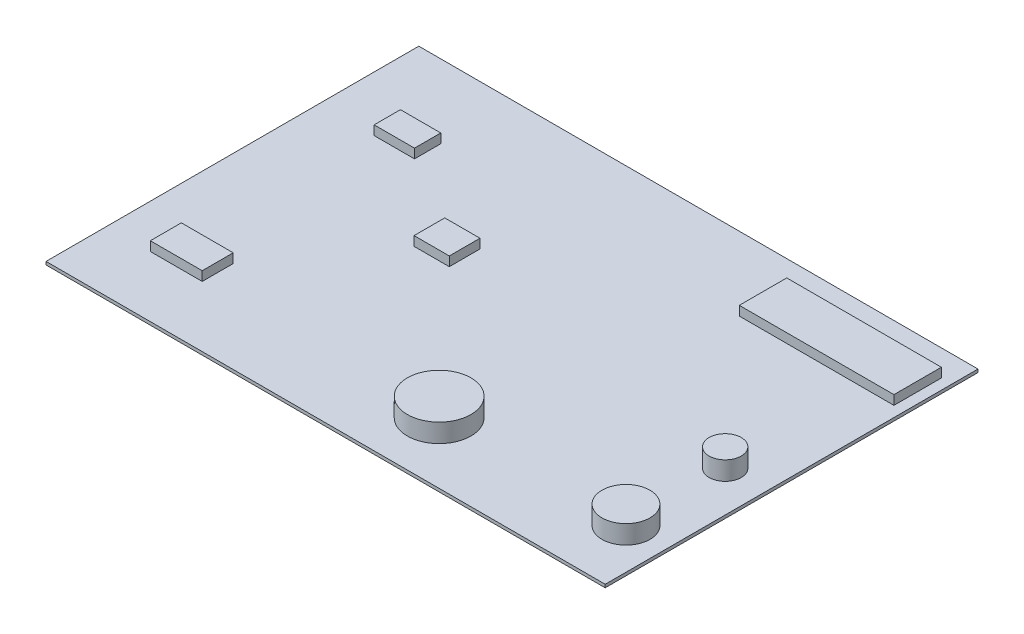
ISO-10303-21;
HEADER;
FILE_DESCRIPTION(('STEP AP214'),'2;1');
FILE_NAME('part.step','',(''),(''),'','','');
FILE_SCHEMA(('AUTOMOTIVE_DESIGN { 1 0 10303 214 1 1 1 1 }'));
ENDSEC;
DATA;
#1=APPLICATION_CONTEXT('core data for automotive mechanical design processes');
#2=APPLICATION_PROTOCOL_DEFINITION('international standard','automotive_design',2000,#1);
#3=PRODUCT_CONTEXT('',#1,'mechanical');
#4=PRODUCT('Part','Part','',(#3));
#5=PRODUCT_RELATED_PRODUCT_CATEGORY('part','',(#4));
#6=PRODUCT_DEFINITION_FORMATION('','',#4);
#7=PRODUCT_DEFINITION_CONTEXT('part definition',#1,'design');
#8=PRODUCT_DEFINITION('design','',#6,#7);
#9=PRODUCT_DEFINITION_SHAPE('','',#8);
#10=(LENGTH_UNIT() NAMED_UNIT(*) SI_UNIT(.MILLI.,.METRE.));
#11=(NAMED_UNIT(*) PLANE_ANGLE_UNIT() SI_UNIT($,.RADIAN.));
#12=(NAMED_UNIT(*) SI_UNIT($,.STERADIAN.) SOLID_ANGLE_UNIT());
#13=UNCERTAINTY_MEASURE_WITH_UNIT(LENGTH_MEASURE(1.E-05),#10,'distance_accuracy_value','');
#14=(GEOMETRIC_REPRESENTATION_CONTEXT(3) GLOBAL_UNCERTAINTY_ASSIGNED_CONTEXT((#13)) GLOBAL_UNIT_ASSIGNED_CONTEXT((#10,
#11,#12)) REPRESENTATION_CONTEXT('',''));
#15=CARTESIAN_POINT('',(0.,0.,0.));
#16=DIRECTION('',(0.,0.,1.));
#17=DIRECTION('',(1.,0.,0.));
#18=AXIS2_PLACEMENT_3D('',#15,#16,#17);
#19=CARTESIAN_POINT('',(0.,1.,0.));
#20=DIRECTION('',(0.,-1.,0.));
#21=DIRECTION('',(0.,0.,-1.));
#22=AXIS2_PLACEMENT_3D('',#19,#20,#21);
#23=PLANE('',#22);
#24=CARTESIAN_POINT('',(16.8474862712031,1.,40.2956843652191));
#25=DIRECTION('',(0.,-1.,0.));
#26=DIRECTION('',(0.,0.,-1.));
#27=AXIS2_PLACEMENT_3D('',#24,#25,#26);
#28=CIRCLE('',#27,10.2338599850955);
#29=CARTESIAN_POINT('',(16.8474862712031,1.,30.0618243801237));
#30=VERTEX_POINT('',#29);
#31=EDGE_CURVE('E11',#30,#30,#28,.F.);
#32=ORIENTED_EDGE('',*,*,#31,.F.);
#33=EDGE_LOOP('',(#32));
#34=FACE_BOUND('',#33,.T.);
#35=CARTESIAN_POINT('',(76.9816351317871,1.,40.2956843652191));
#36=DIRECTION('',(0.,-1.,0.));
#37=DIRECTION('',(0.,0.,-1.));
#38=AXIS2_PLACEMENT_3D('',#35,#36,#37);
#39=CIRCLE('',#38,7.72493284853617);
#40=CARTESIAN_POINT('',(76.9816351317871,1.,32.570751516683));
#41=VERTEX_POINT('',#40);
#42=EDGE_CURVE('E48',#41,#41,#39,.F.);
#43=ORIENTED_EDGE('',*,*,#42,.F.);
#44=EDGE_LOOP('',(#43));
#45=FACE_BOUND('',#44,.T.);
#46=CARTESIAN_POINT('',(76.9816351317871,1.,8.35863831628103));
#47=DIRECTION('',(0.,-1.,0.));
#48=DIRECTION('',(0.,0.,-1.));
#49=AXIS2_PLACEMENT_3D('',#46,#47,#48);
#50=CIRCLE('',#49,5.16431418154601);
#51=CARTESIAN_POINT('',(76.9816351317871,1.,3.19432413473502));
#52=VERTEX_POINT('',#51);
#53=EDGE_CURVE('E384',#52,#52,#50,.F.);
#54=ORIENTED_EDGE('',*,*,#53,.F.);
#55=EDGE_LOOP('',(#54));
#56=FACE_BOUND('',#55,.T.);
#57=DIRECTION('',(0.,0.,1.));
#58=VECTOR('',#57,1.);
#59=CARTESIAN_POINT('',(-34.9516533845815,1.,-13.3040241738058));
#60=LINE('',#59,#58);
#61=CARTESIAN_POINT('',(-34.9516533845815,1.,-13.3040241738058));
#62=VERTEX_POINT('',#61);
#63=CARTESIAN_POINT('',(-34.9516533845815,1.,-3.43040683304707));
#64=VERTEX_POINT('',#63);
#65=EDGE_CURVE('E201',#62,#64,#60,.T.);
#66=ORIENTED_EDGE('',*,*,#65,.F.);
#67=DIRECTION('',(-1.,0.,0.));
#68=VECTOR('',#67,1.);
#69=CARTESIAN_POINT('',(-34.9516533845815,1.,-13.3040241738058));
#70=LINE('',#69,#68);
#71=CARTESIAN_POINT('',(-23.6168154125664,1.,-13.3040241738058));
#72=VERTEX_POINT('',#71);
#73=EDGE_CURVE('E217',#72,#62,#70,.T.);
#74=ORIENTED_EDGE('',*,*,#73,.F.);
#75=DIRECTION('',(0.,0.,-1.));
#76=VECTOR('',#75,1.);
#77=CARTESIAN_POINT('',(-23.6168154125664,1.,-13.3040241738058));
#78=LINE('',#77,#76);
#79=CARTESIAN_POINT('',(-23.6168154125664,1.,-3.43040683304707));
#80=VERTEX_POINT('',#79);
#81=EDGE_CURVE('E230',#80,#72,#78,.T.);
#82=ORIENTED_EDGE('',*,*,#81,.F.);
#83=DIRECTION('',(1.,0.,0.));
#84=VECTOR('',#83,1.);
#85=CARTESIAN_POINT('',(-34.9516533845815,1.,-3.43040683304707));
#86=LINE('',#85,#84);
#87=EDGE_CURVE('E206',#64,#80,#86,.T.);
#88=ORIENTED_EDGE('',*,*,#87,.F.);
#89=EDGE_LOOP('',(#66,#74,#82,#88));
#90=FACE_BOUND('',#89,.T.);
#91=DIRECTION('',(0.,0.,1.));
#92=VECTOR('',#91,1.);
#93=CARTESIAN_POINT('',(-72.2537385696,1.,-36.3383077715866));
#94=LINE('',#93,#92);
#95=CARTESIAN_POINT('',(-72.2537385696,1.,-36.3383077715866));
#96=VERTEX_POINT('',#95);
#97=CARTESIAN_POINT('',(-72.2537385696,1.,-27.8803468449951));
#98=VERTEX_POINT('',#97);
#99=EDGE_CURVE('E297',#96,#98,#94,.T.);
#100=ORIENTED_EDGE('',*,*,#99,.F.);
#101=DIRECTION('',(-1.,0.,0.));
#102=VECTOR('',#101,1.);
#103=CARTESIAN_POINT('',(-72.2537385696,1.,-36.3383077715866));
#104=LINE('',#103,#102);
#105=CARTESIAN_POINT('',(-59.2684442577252,1.,-36.3383077715866));
#106=VERTEX_POINT('',#105);
#107=EDGE_CURVE('E303',#106,#96,#104,.T.);
#108=ORIENTED_EDGE('',*,*,#107,.F.);
#109=DIRECTION('',(0.,0.,-1.));
#110=VECTOR('',#109,1.);
#111=CARTESIAN_POINT('',(-59.2684442577252,1.,-36.3383077715866));
#112=LINE('',#111,#110);
#113=CARTESIAN_POINT('',(-59.2684442577252,1.,-27.8803468449951));
#114=VERTEX_POINT('',#113);
#115=EDGE_CURVE('E320',#114,#106,#112,.T.);
#116=ORIENTED_EDGE('',*,*,#115,.F.);
#117=DIRECTION('',(1.,0.,0.));
#118=VECTOR('',#117,1.);
#119=CARTESIAN_POINT('',(-72.2537385696,1.,-27.8803468449951));
#120=LINE('',#119,#118);
#121=EDGE_CURVE('E316',#98,#114,#120,.T.);
#122=ORIENTED_EDGE('',*,*,#121,.F.);
#123=EDGE_LOOP('',(#100,#108,#116,#122));
#124=FACE_BOUND('',#123,.T.);
#125=DIRECTION('',(0.,0.,-1.));
#126=VECTOR('',#125,1.);
#127=CARTESIAN_POINT('',(90.,1.,60.));
#128=LINE('',#127,#126);
#129=CARTESIAN_POINT('',(90.,1.,60.));
#130=VERTEX_POINT('',#129);
#131=CARTESIAN_POINT('',(90.,1.,-60.));
#132=VERTEX_POINT('',#131);
#133=EDGE_CURVE('E343',#130,#132,#128,.T.);
#134=ORIENTED_EDGE('',*,*,#133,.T.);
#135=DIRECTION('',(-1.,0.,0.));
#136=VECTOR('',#135,1.);
#137=CARTESIAN_POINT('',(-90.,1.,-60.));
#138=LINE('',#137,#136);
#139=CARTESIAN_POINT('',(-90.,1.,-60.));
#140=VERTEX_POINT('',#139);
#141=EDGE_CURVE('E347',#132,#140,#138,.T.);
#142=ORIENTED_EDGE('',*,*,#141,.T.);
#143=DIRECTION('',(0.,0.,1.));
#144=VECTOR('',#143,1.);
#145=CARTESIAN_POINT('',(-90.,1.,60.));
#146=LINE('',#145,#144);
#147=CARTESIAN_POINT('',(-90.,1.,60.));
#148=VERTEX_POINT('',#147);
#149=EDGE_CURVE('E351',#140,#148,#146,.T.);
#150=ORIENTED_EDGE('',*,*,#149,.T.);
#151=DIRECTION('',(1.,0.,0.));
#152=VECTOR('',#151,1.);
#153=CARTESIAN_POINT('',(-90.,1.,60.));
#154=LINE('',#153,#152);
#155=EDGE_CURVE('E354',#148,#130,#154,.T.);
#156=ORIENTED_EDGE('',*,*,#155,.T.);
#157=EDGE_LOOP('',(#134,#142,#150,#156));
#158=FACE_BOUND('',#157,.T.);
#159=DIRECTION('',(0.,0.,1.));
#160=VECTOR('',#159,1.);
#161=CARTESIAN_POINT('',(-75.9696448933767,1.,30.4685909084697));
#162=LINE('',#161,#160);
#163=CARTESIAN_POINT('',(-75.9696448933767,1.,30.4685909084697));
#164=VERTEX_POINT('',#163);
#165=CARTESIAN_POINT('',(-75.9696448933767,1.,40.4487067058312));
#166=VERTEX_POINT('',#165);
#167=EDGE_CURVE('E252',#164,#166,#162,.T.);
#168=ORIENTED_EDGE('',*,*,#167,.F.);
#169=DIRECTION('',(-1.,0.,0.));
#170=VECTOR('',#169,1.);
#171=CARTESIAN_POINT('',(-75.9696448933767,1.,30.4685909084697));
#172=LINE('',#171,#170);
#173=CARTESIAN_POINT('',(-59.2684442577252,1.,30.4685909084697));
#174=VERTEX_POINT('',#173);
#175=EDGE_CURVE('E258',#174,#164,#172,.T.);
#176=ORIENTED_EDGE('',*,*,#175,.F.);
#177=DIRECTION('',(0.,0.,-1.));
#178=VECTOR('',#177,1.);
#179=CARTESIAN_POINT('',(-59.2684442577252,1.,30.4685909084697));
#180=LINE('',#179,#178);
#181=CARTESIAN_POINT('',(-59.2684442577252,1.,40.4487067058312));
#182=VERTEX_POINT('',#181);
#183=EDGE_CURVE('E275',#182,#174,#180,.T.);
#184=ORIENTED_EDGE('',*,*,#183,.F.);
#185=DIRECTION('',(1.,0.,0.));
#186=VECTOR('',#185,1.);
#187=CARTESIAN_POINT('',(-75.9696448933767,1.,40.4487067058312));
#188=LINE('',#187,#186);
#189=EDGE_CURVE('E271',#166,#182,#188,.T.);
#190=ORIENTED_EDGE('',*,*,#189,.F.);
#191=EDGE_LOOP('',(#168,#176,#184,#190));
#192=FACE_BOUND('',#191,.T.);
#193=DIRECTION('',(0.,0.,1.));
#194=VECTOR('',#193,1.);
#195=CARTESIAN_POINT('',(36.8266407692666,1.,-51.6079635185065));
#196=LINE('',#195,#194);
#197=CARTESIAN_POINT('',(36.8266407692666,1.,-51.6079635185065));
#198=VERTEX_POINT('',#197);
#199=CARTESIAN_POINT('',(36.8266407692666,1.,-36.3383077715866));
#200=VERTEX_POINT('',#199);
#201=EDGE_CURVE('E199',#198,#200,#196,.T.);
#202=ORIENTED_EDGE('',*,*,#201,.F.);
#203=DIRECTION('',(-1.,0.,0.));
#204=VECTOR('',#203,1.);
#205=CARTESIAN_POINT('',(36.8266407692666,1.,-51.6079635185065));
#206=LINE('',#205,#204);
#207=CARTESIAN_POINT('',(86.603705340913,1.,-51.6079635185065));
#208=VERTEX_POINT('',#207);
#209=EDGE_CURVE('E196',#208,#198,#206,.T.);
#210=ORIENTED_EDGE('',*,*,#209,.F.);
#211=DIRECTION('',(0.,0.,-1.));
#212=VECTOR('',#211,1.);
#213=CARTESIAN_POINT('',(86.603705340913,1.,-51.6079635185065));
#214=LINE('',#213,#212);
#215=CARTESIAN_POINT('',(86.603705340913,1.,-36.3383077715866));
#216=VERTEX_POINT('',#215);
#217=EDGE_CURVE('E60',#216,#208,#214,.T.);
#218=ORIENTED_EDGE('',*,*,#217,.F.);
#219=DIRECTION('',(1.,0.,0.));
#220=VECTOR('',#219,1.);
#221=CARTESIAN_POINT('',(36.8266407692666,1.,-36.3383077715866));
#222=LINE('',#221,#220);
#223=EDGE_CURVE('E55',#200,#216,#222,.T.);
#224=ORIENTED_EDGE('',*,*,#223,.F.);
#225=EDGE_LOOP('',(#202,#210,#218,#224));
#226=FACE_BOUND('',#225,.T.);
#227=ADVANCED_FACE('F39',(#34,#45,#56,#90,#124,#158,#192,#226),#23,.F.);
#228=CARTESIAN_POINT('',(90.,1.,60.));
#229=DIRECTION('',(-1.,0.,0.));
#230=DIRECTION('',(0.,0.,1.));
#231=AXIS2_PLACEMENT_3D('',#228,#229,#230);
#232=PLANE('',#231);
#233=DIRECTION('',(0.,0.,-1.));
#234=VECTOR('',#233,1.);
#235=CARTESIAN_POINT('',(90.,0.,60.));
#236=LINE('',#235,#234);
#237=CARTESIAN_POINT('',(90.,0.,60.));
#238=VERTEX_POINT('',#237);
#239=CARTESIAN_POINT('',(90.,0.,-60.));
#240=VERTEX_POINT('',#239);
#241=EDGE_CURVE('E342',#238,#240,#236,.T.);
#242=ORIENTED_EDGE('',*,*,#241,.T.);
#243=DIRECTION('',(0.,-1.,0.));
#244=VECTOR('',#243,1.);
#245=CARTESIAN_POINT('',(90.,1.,-60.));
#246=LINE('',#245,#244);
#247=EDGE_CURVE('E380',#132,#240,#246,.T.);
#248=ORIENTED_EDGE('',*,*,#247,.F.);
#249=ORIENTED_EDGE('',*,*,#133,.F.);
#250=DIRECTION('',(0.,-1.,0.));
#251=VECTOR('',#250,1.);
#252=CARTESIAN_POINT('',(90.,1.,60.));
#253=LINE('',#252,#251);
#254=EDGE_CURVE('E357',#130,#238,#253,.T.);
#255=ORIENTED_EDGE('',*,*,#254,.T.);
#256=EDGE_LOOP('',(#242,#248,#249,#255));
#257=FACE_BOUND('',#256,.T.);
#258=ADVANCED_FACE('F41',(#257),#232,.F.);
#259=CARTESIAN_POINT('',(-90.,1.,-60.));
#260=DIRECTION('',(0.,0.,1.));
#261=DIRECTION('',(1.,0.,0.));
#262=AXIS2_PLACEMENT_3D('',#259,#260,#261);
#263=PLANE('',#262);
#264=DIRECTION('',(-1.,0.,0.));
#265=VECTOR('',#264,1.);
#266=CARTESIAN_POINT('',(-90.,0.,-60.));
#267=LINE('',#266,#265);
#268=CARTESIAN_POINT('',(-90.,0.,-60.));
#269=VERTEX_POINT('',#268);
#270=EDGE_CURVE('E361',#240,#269,#267,.T.);
#271=ORIENTED_EDGE('',*,*,#270,.T.);
#272=DIRECTION('',(0.,-1.,0.));
#273=VECTOR('',#272,1.);
#274=CARTESIAN_POINT('',(-90.,1.,-60.));
#275=LINE('',#274,#273);
#276=EDGE_CURVE('E376',#140,#269,#275,.T.);
#277=ORIENTED_EDGE('',*,*,#276,.F.);
#278=ORIENTED_EDGE('',*,*,#141,.F.);
#279=ORIENTED_EDGE('',*,*,#247,.T.);
#280=EDGE_LOOP('',(#271,#277,#278,#279));
#281=FACE_BOUND('',#280,.T.);
#282=ADVANCED_FACE('F548',(#281),#263,.F.);
#283=CARTESIAN_POINT('',(-90.,1.,60.));
#284=DIRECTION('',(1.,0.,0.));
#285=DIRECTION('',(0.,0.,-1.));
#286=AXIS2_PLACEMENT_3D('',#283,#284,#285);
#287=PLANE('',#286);
#288=DIRECTION('',(0.,0.,1.));
#289=VECTOR('',#288,1.);
#290=CARTESIAN_POINT('',(-90.,0.,60.));
#291=LINE('',#290,#289);
#292=CARTESIAN_POINT('',(-90.,0.,60.));
#293=VERTEX_POINT('',#292);
#294=EDGE_CURVE('E364',#269,#293,#291,.T.);
#295=ORIENTED_EDGE('',*,*,#294,.T.);
#296=DIRECTION('',(0.,-1.,0.));
#297=VECTOR('',#296,1.);
#298=CARTESIAN_POINT('',(-90.,1.,60.));
#299=LINE('',#298,#297);
#300=EDGE_CURVE('E372',#148,#293,#299,.T.);
#301=ORIENTED_EDGE('',*,*,#300,.F.);
#302=ORIENTED_EDGE('',*,*,#149,.F.);
#303=ORIENTED_EDGE('',*,*,#276,.T.);
#304=EDGE_LOOP('',(#295,#301,#302,#303));
#305=FACE_BOUND('',#304,.T.);
#306=ADVANCED_FACE('F545',(#305),#287,.F.);
#307=CARTESIAN_POINT('',(-90.,1.,60.));
#308=DIRECTION('',(0.,0.,-1.));
#309=DIRECTION('',(-1.,0.,0.));
#310=AXIS2_PLACEMENT_3D('',#307,#308,#309);
#311=PLANE('',#310);
#312=DIRECTION('',(1.,0.,0.));
#313=VECTOR('',#312,1.);
#314=CARTESIAN_POINT('',(-90.,0.,60.));
#315=LINE('',#314,#313);
#316=EDGE_CURVE('E348',#293,#238,#315,.T.);
#317=ORIENTED_EDGE('',*,*,#316,.T.);
#318=ORIENTED_EDGE('',*,*,#254,.F.);
#319=ORIENTED_EDGE('',*,*,#155,.F.);
#320=ORIENTED_EDGE('',*,*,#300,.T.);
#321=EDGE_LOOP('',(#317,#318,#319,#320));
#322=FACE_BOUND('',#321,.T.);
#323=ADVANCED_FACE('F541',(#322),#311,.F.);
#324=CARTESIAN_POINT('',(0.,0.,0.));
#325=DIRECTION('',(0.,-1.,0.));
#326=DIRECTION('',(0.,0.,-1.));
#327=AXIS2_PLACEMENT_3D('',#324,#325,#326);
#328=PLANE('',#327);
#329=ORIENTED_EDGE('',*,*,#241,.F.);
#330=ORIENTED_EDGE('',*,*,#316,.F.);
#331=ORIENTED_EDGE('',*,*,#294,.F.);
#332=ORIENTED_EDGE('',*,*,#270,.F.);
#333=EDGE_LOOP('',(#329,#330,#331,#332));
#334=FACE_BOUND('',#333,.T.);
#335=ADVANCED_FACE('F536',(#334),#328,.T.);
#336=CARTESIAN_POINT('',(-72.2537385696,4.,-36.3383077715866));
#337=DIRECTION('',(1.,0.,0.));
#338=DIRECTION('',(0.,0.,-1.));
#339=AXIS2_PLACEMENT_3D('',#336,#337,#338);
#340=PLANE('',#339);
#341=ORIENTED_EDGE('',*,*,#99,.T.);
#342=DIRECTION('',(0.,-1.,0.));
#343=VECTOR('',#342,1.);
#344=CARTESIAN_POINT('',(-72.2537385696,4.,-27.8803468449951));
#345=LINE('',#344,#343);
#346=CARTESIAN_POINT('',(-72.2537385696,4.,-27.8803468449951));
#347=VERTEX_POINT('',#346);
#348=EDGE_CURVE('E338',#347,#98,#345,.T.);
#349=ORIENTED_EDGE('',*,*,#348,.F.);
#350=DIRECTION('',(0.,0.,1.));
#351=VECTOR('',#350,1.);
#352=CARTESIAN_POINT('',(-72.2537385696,4.,-36.3383077715866));
#353=LINE('',#352,#351);
#354=CARTESIAN_POINT('',(-72.2537385696,4.,-36.3383077715866));
#355=VERTEX_POINT('',#354);
#356=EDGE_CURVE('E298',#355,#347,#353,.T.);
#357=ORIENTED_EDGE('',*,*,#356,.F.);
#358=DIRECTION('',(0.,-1.,0.));
#359=VECTOR('',#358,1.);
#360=CARTESIAN_POINT('',(-72.2537385696,4.,-36.3383077715866));
#361=LINE('',#360,#359);
#362=EDGE_CURVE('E312',#355,#96,#361,.T.);
#363=ORIENTED_EDGE('',*,*,#362,.T.);
#364=EDGE_LOOP('',(#341,#349,#357,#363));
#365=FACE_BOUND('',#364,.T.);
#366=ADVANCED_FACE('F533',(#365),#340,.F.);
#367=CARTESIAN_POINT('',(-72.2537385696,4.,-27.8803468449951));
#368=DIRECTION('',(0.,0.,-1.));
#369=DIRECTION('',(-1.,0.,0.));
#370=AXIS2_PLACEMENT_3D('',#367,#368,#369);
#371=PLANE('',#370);
#372=ORIENTED_EDGE('',*,*,#121,.T.);
#373=DIRECTION('',(0.,-1.,0.));
#374=VECTOR('',#373,1.);
#375=CARTESIAN_POINT('',(-59.2684442577252,4.,-27.8803468449951));
#376=LINE('',#375,#374);
#377=CARTESIAN_POINT('',(-59.2684442577252,4.,-27.8803468449951));
#378=VERTEX_POINT('',#377);
#379=EDGE_CURVE('E334',#378,#114,#376,.T.);
#380=ORIENTED_EDGE('',*,*,#379,.F.);
#381=DIRECTION('',(1.,0.,0.));
#382=VECTOR('',#381,1.);
#383=CARTESIAN_POINT('',(-72.2537385696,4.,-27.8803468449951));
#384=LINE('',#383,#382);
#385=EDGE_CURVE('E302',#347,#378,#384,.T.);
#386=ORIENTED_EDGE('',*,*,#385,.F.);
#387=ORIENTED_EDGE('',*,*,#348,.T.);
#388=EDGE_LOOP('',(#372,#380,#386,#387));
#389=FACE_BOUND('',#388,.T.);
#390=ADVANCED_FACE('F529',(#389),#371,.F.);
#391=CARTESIAN_POINT('',(-59.2684442577252,4.,-36.3383077715866));
#392=DIRECTION('',(-1.,0.,0.));
#393=DIRECTION('',(0.,0.,1.));
#394=AXIS2_PLACEMENT_3D('',#391,#392,#393);
#395=PLANE('',#394);
#396=ORIENTED_EDGE('',*,*,#115,.T.);
#397=DIRECTION('',(0.,-1.,0.));
#398=VECTOR('',#397,1.);
#399=CARTESIAN_POINT('',(-59.2684442577252,4.,-36.3383077715866));
#400=LINE('',#399,#398);
#401=CARTESIAN_POINT('',(-59.2684442577252,4.,-36.3383077715866));
#402=VERTEX_POINT('',#401);
#403=EDGE_CURVE('E330',#402,#106,#400,.T.);
#404=ORIENTED_EDGE('',*,*,#403,.F.);
#405=DIRECTION('',(0.,0.,-1.));
#406=VECTOR('',#405,1.);
#407=CARTESIAN_POINT('',(-59.2684442577252,4.,-36.3383077715866));
#408=LINE('',#407,#406);
#409=EDGE_CURVE('E306',#378,#402,#408,.T.);
#410=ORIENTED_EDGE('',*,*,#409,.F.);
#411=ORIENTED_EDGE('',*,*,#379,.T.);
#412=EDGE_LOOP('',(#396,#404,#410,#411));
#413=FACE_BOUND('',#412,.T.);
#414=ADVANCED_FACE('F525',(#413),#395,.F.);
#415=CARTESIAN_POINT('',(-72.2537385696,4.,-36.3383077715866));
#416=DIRECTION('',(0.,0.,1.));
#417=DIRECTION('',(1.,0.,0.));
#418=AXIS2_PLACEMENT_3D('',#415,#416,#417);
#419=PLANE('',#418);
#420=ORIENTED_EDGE('',*,*,#107,.T.);
#421=ORIENTED_EDGE('',*,*,#362,.F.);
#422=DIRECTION('',(-1.,0.,0.));
#423=VECTOR('',#422,1.);
#424=CARTESIAN_POINT('',(-72.2537385696,4.,-36.3383077715866));
#425=LINE('',#424,#423);
#426=EDGE_CURVE('E309',#402,#355,#425,.T.);
#427=ORIENTED_EDGE('',*,*,#426,.F.);
#428=ORIENTED_EDGE('',*,*,#403,.T.);
#429=EDGE_LOOP('',(#420,#421,#427,#428));
#430=FACE_BOUND('',#429,.T.);
#431=ADVANCED_FACE('F521',(#430),#419,.F.);
#432=CARTESIAN_POINT('',(0.,4.,0.));
#433=DIRECTION('',(0.,1.,0.));
#434=DIRECTION('',(0.,0.,1.));
#435=AXIS2_PLACEMENT_3D('',#432,#433,#434);
#436=PLANE('',#435);
#437=ORIENTED_EDGE('',*,*,#356,.T.);
#438=ORIENTED_EDGE('',*,*,#385,.T.);
#439=ORIENTED_EDGE('',*,*,#409,.T.);
#440=ORIENTED_EDGE('',*,*,#426,.T.);
#441=EDGE_LOOP('',(#437,#438,#439,#440));
#442=FACE_BOUND('',#441,.T.);
#443=ADVANCED_FACE('F517',(#442),#436,.T.);
#444=CARTESIAN_POINT('',(-75.9696448933767,4.,30.4685909084697));
#445=DIRECTION('',(1.,0.,0.));
#446=DIRECTION('',(0.,0.,-1.));
#447=AXIS2_PLACEMENT_3D('',#444,#445,#446);
#448=PLANE('',#447);
#449=ORIENTED_EDGE('',*,*,#167,.T.);
#450=DIRECTION('',(0.,-1.,0.));
#451=VECTOR('',#450,1.);
#452=CARTESIAN_POINT('',(-75.9696448933767,4.,40.4487067058312));
#453=LINE('',#452,#451);
#454=CARTESIAN_POINT('',(-75.9696448933767,4.,40.4487067058312));
#455=VERTEX_POINT('',#454);
#456=EDGE_CURVE('E293',#455,#166,#453,.T.);
#457=ORIENTED_EDGE('',*,*,#456,.F.);
#458=DIRECTION('',(0.,0.,1.));
#459=VECTOR('',#458,1.);
#460=CARTESIAN_POINT('',(-75.9696448933767,4.,30.4685909084697));
#461=LINE('',#460,#459);
#462=CARTESIAN_POINT('',(-75.9696448933767,4.,30.4685909084697));
#463=VERTEX_POINT('',#462);
#464=EDGE_CURVE('E253',#463,#455,#461,.T.);
#465=ORIENTED_EDGE('',*,*,#464,.F.);
#466=DIRECTION('',(0.,-1.,0.));
#467=VECTOR('',#466,1.);
#468=CARTESIAN_POINT('',(-75.9696448933767,4.,30.4685909084697));
#469=LINE('',#468,#467);
#470=EDGE_CURVE('E267',#463,#164,#469,.T.);
#471=ORIENTED_EDGE('',*,*,#470,.T.);
#472=EDGE_LOOP('',(#449,#457,#465,#471));
#473=FACE_BOUND('',#472,.T.);
#474=ADVANCED_FACE('F513',(#473),#448,.F.);
#475=CARTESIAN_POINT('',(-75.9696448933767,4.,40.4487067058312));
#476=DIRECTION('',(0.,0.,-1.));
#477=DIRECTION('',(-1.,0.,0.));
#478=AXIS2_PLACEMENT_3D('',#475,#476,#477);
#479=PLANE('',#478);
#480=ORIENTED_EDGE('',*,*,#189,.T.);
#481=DIRECTION('',(0.,-1.,0.));
#482=VECTOR('',#481,1.);
#483=CARTESIAN_POINT('',(-59.2684442577252,4.,40.4487067058312));
#484=LINE('',#483,#482);
#485=CARTESIAN_POINT('',(-59.2684442577252,4.,40.4487067058312));
#486=VERTEX_POINT('',#485);
#487=EDGE_CURVE('E289',#486,#182,#484,.T.);
#488=ORIENTED_EDGE('',*,*,#487,.F.);
#489=DIRECTION('',(1.,0.,0.));
#490=VECTOR('',#489,1.);
#491=CARTESIAN_POINT('',(-75.9696448933767,4.,40.4487067058312));
#492=LINE('',#491,#490);
#493=EDGE_CURVE('E257',#455,#486,#492,.T.);
#494=ORIENTED_EDGE('',*,*,#493,.F.);
#495=ORIENTED_EDGE('',*,*,#456,.T.);
#496=EDGE_LOOP('',(#480,#488,#494,#495));
#497=FACE_BOUND('',#496,.T.);
#498=ADVANCED_FACE('F509',(#497),#479,.F.);
#499=CARTESIAN_POINT('',(-59.2684442577252,4.,30.4685909084697));
#500=DIRECTION('',(-1.,0.,0.));
#501=DIRECTION('',(0.,0.,1.));
#502=AXIS2_PLACEMENT_3D('',#499,#500,#501);
#503=PLANE('',#502);
#504=ORIENTED_EDGE('',*,*,#183,.T.);
#505=DIRECTION('',(0.,-1.,0.));
#506=VECTOR('',#505,1.);
#507=CARTESIAN_POINT('',(-59.2684442577252,4.,30.4685909084697));
#508=LINE('',#507,#506);
#509=CARTESIAN_POINT('',(-59.2684442577252,4.,30.4685909084697));
#510=VERTEX_POINT('',#509);
#511=EDGE_CURVE('E285',#510,#174,#508,.T.);
#512=ORIENTED_EDGE('',*,*,#511,.F.);
#513=DIRECTION('',(0.,0.,-1.));
#514=VECTOR('',#513,1.);
#515=CARTESIAN_POINT('',(-59.2684442577252,4.,30.4685909084697));
#516=LINE('',#515,#514);
#517=EDGE_CURVE('E261',#486,#510,#516,.T.);
#518=ORIENTED_EDGE('',*,*,#517,.F.);
#519=ORIENTED_EDGE('',*,*,#487,.T.);
#520=EDGE_LOOP('',(#504,#512,#518,#519));
#521=FACE_BOUND('',#520,.T.);
#522=ADVANCED_FACE('F505',(#521),#503,.F.);
#523=CARTESIAN_POINT('',(-75.9696448933767,4.,30.4685909084697));
#524=DIRECTION('',(0.,0.,1.));
#525=DIRECTION('',(1.,0.,0.));
#526=AXIS2_PLACEMENT_3D('',#523,#524,#525);
#527=PLANE('',#526);
#528=ORIENTED_EDGE('',*,*,#175,.T.);
#529=ORIENTED_EDGE('',*,*,#470,.F.);
#530=DIRECTION('',(-1.,0.,0.));
#531=VECTOR('',#530,1.);
#532=CARTESIAN_POINT('',(-75.9696448933767,4.,30.4685909084697));
#533=LINE('',#532,#531);
#534=EDGE_CURVE('E264',#510,#463,#533,.T.);
#535=ORIENTED_EDGE('',*,*,#534,.F.);
#536=ORIENTED_EDGE('',*,*,#511,.T.);
#537=EDGE_LOOP('',(#528,#529,#535,#536));
#538=FACE_BOUND('',#537,.T.);
#539=ADVANCED_FACE('F501',(#538),#527,.F.);
#540=CARTESIAN_POINT('',(0.,4.,0.));
#541=DIRECTION('',(0.,1.,0.));
#542=DIRECTION('',(0.,0.,1.));
#543=AXIS2_PLACEMENT_3D('',#540,#541,#542);
#544=PLANE('',#543);
#545=ORIENTED_EDGE('',*,*,#464,.T.);
#546=ORIENTED_EDGE('',*,*,#493,.T.);
#547=ORIENTED_EDGE('',*,*,#517,.T.);
#548=ORIENTED_EDGE('',*,*,#534,.T.);
#549=EDGE_LOOP('',(#545,#546,#547,#548));
#550=FACE_BOUND('',#549,.T.);
#551=ADVANCED_FACE('F497',(#550),#544,.T.);
#552=CARTESIAN_POINT('',(-34.9516533845815,4.,-13.3040241738058));
#553=DIRECTION('',(1.,0.,0.));
#554=DIRECTION('',(0.,0.,-1.));
#555=AXIS2_PLACEMENT_3D('',#552,#553,#554);
#556=PLANE('',#555);
#557=ORIENTED_EDGE('',*,*,#65,.T.);
#558=DIRECTION('',(0.,-1.,0.));
#559=VECTOR('',#558,1.);
#560=CARTESIAN_POINT('',(-34.9516533845815,4.,-3.43040683304707));
#561=LINE('',#560,#559);
#562=CARTESIAN_POINT('',(-34.9516533845815,4.,-3.43040683304707));
#563=VERTEX_POINT('',#562);
#564=EDGE_CURVE('E248',#563,#64,#561,.T.);
#565=ORIENTED_EDGE('',*,*,#564,.F.);
#566=DIRECTION('',(0.,0.,1.));
#567=VECTOR('',#566,1.);
#568=CARTESIAN_POINT('',(-34.9516533845815,4.,-13.3040241738058));
#569=LINE('',#568,#567);
#570=CARTESIAN_POINT('',(-34.9516533845815,4.,-13.3040241738058));
#571=VERTEX_POINT('',#570);
#572=EDGE_CURVE('E212',#571,#563,#569,.T.);
#573=ORIENTED_EDGE('',*,*,#572,.F.);
#574=DIRECTION('',(0.,-1.,0.));
#575=VECTOR('',#574,1.);
#576=CARTESIAN_POINT('',(-34.9516533845815,4.,-13.3040241738058));
#577=LINE('',#576,#575);
#578=EDGE_CURVE('E225',#571,#62,#577,.T.);
#579=ORIENTED_EDGE('',*,*,#578,.T.);
#580=EDGE_LOOP('',(#557,#565,#573,#579));
#581=FACE_BOUND('',#580,.T.);
#582=ADVANCED_FACE('F493',(#581),#556,.F.);
#583=CARTESIAN_POINT('',(-34.9516533845815,4.,-3.43040683304707));
#584=DIRECTION('',(0.,0.,-1.));
#585=DIRECTION('',(-1.,0.,0.));
#586=AXIS2_PLACEMENT_3D('',#583,#584,#585);
#587=PLANE('',#586);
#588=ORIENTED_EDGE('',*,*,#87,.T.);
#589=DIRECTION('',(0.,-1.,0.));
#590=VECTOR('',#589,1.);
#591=CARTESIAN_POINT('',(-23.6168154125664,4.,-3.43040683304707));
#592=LINE('',#591,#590);
#593=CARTESIAN_POINT('',(-23.6168154125664,4.,-3.43040683304707));
#594=VERTEX_POINT('',#593);
#595=EDGE_CURVE('E244',#594,#80,#592,.T.);
#596=ORIENTED_EDGE('',*,*,#595,.F.);
#597=DIRECTION('',(1.,0.,0.));
#598=VECTOR('',#597,1.);
#599=CARTESIAN_POINT('',(-34.9516533845815,4.,-3.43040683304707));
#600=LINE('',#599,#598);
#601=EDGE_CURVE('E216',#563,#594,#600,.T.);
#602=ORIENTED_EDGE('',*,*,#601,.F.);
#603=ORIENTED_EDGE('',*,*,#564,.T.);
#604=EDGE_LOOP('',(#588,#596,#602,#603));
#605=FACE_BOUND('',#604,.T.);
#606=ADVANCED_FACE('F489',(#605),#587,.F.);
#607=CARTESIAN_POINT('',(-23.6168154125664,4.,-13.3040241738058));
#608=DIRECTION('',(-1.,0.,0.));
#609=DIRECTION('',(0.,0.,1.));
#610=AXIS2_PLACEMENT_3D('',#607,#608,#609);
#611=PLANE('',#610);
#612=ORIENTED_EDGE('',*,*,#81,.T.);
#613=DIRECTION('',(0.,-1.,0.));
#614=VECTOR('',#613,1.);
#615=CARTESIAN_POINT('',(-23.6168154125664,4.,-13.3040241738058));
#616=LINE('',#615,#614);
#617=CARTESIAN_POINT('',(-23.6168154125664,4.,-13.3040241738058));
#618=VERTEX_POINT('',#617);
#619=EDGE_CURVE('E240',#618,#72,#616,.T.);
#620=ORIENTED_EDGE('',*,*,#619,.F.);
#621=DIRECTION('',(0.,0.,-1.));
#622=VECTOR('',#621,1.);
#623=CARTESIAN_POINT('',(-23.6168154125664,4.,-13.3040241738058));
#624=LINE('',#623,#622);
#625=EDGE_CURVE('E220',#594,#618,#624,.T.);
#626=ORIENTED_EDGE('',*,*,#625,.F.);
#627=ORIENTED_EDGE('',*,*,#595,.T.);
#628=EDGE_LOOP('',(#612,#620,#626,#627));
#629=FACE_BOUND('',#628,.T.);
#630=ADVANCED_FACE('F485',(#629),#611,.F.);
#631=CARTESIAN_POINT('',(-34.9516533845815,4.,-13.3040241738058));
#632=DIRECTION('',(0.,0.,1.));
#633=DIRECTION('',(1.,0.,0.));
#634=AXIS2_PLACEMENT_3D('',#631,#632,#633);
#635=PLANE('',#634);
#636=ORIENTED_EDGE('',*,*,#73,.T.);
#637=ORIENTED_EDGE('',*,*,#578,.F.);
#638=DIRECTION('',(-1.,0.,0.));
#639=VECTOR('',#638,1.);
#640=CARTESIAN_POINT('',(-34.9516533845815,4.,-13.3040241738058));
#641=LINE('',#640,#639);
#642=EDGE_CURVE('E223',#618,#571,#641,.T.);
#643=ORIENTED_EDGE('',*,*,#642,.F.);
#644=ORIENTED_EDGE('',*,*,#619,.T.);
#645=EDGE_LOOP('',(#636,#637,#643,#644));
#646=FACE_BOUND('',#645,.T.);
#647=ADVANCED_FACE('F481',(#646),#635,.F.);
#648=CARTESIAN_POINT('',(0.,4.,0.));
#649=DIRECTION('',(0.,1.,0.));
#650=DIRECTION('',(0.,0.,1.));
#651=AXIS2_PLACEMENT_3D('',#648,#649,#650);
#652=PLANE('',#651);
#653=ORIENTED_EDGE('',*,*,#572,.T.);
#654=ORIENTED_EDGE('',*,*,#601,.T.);
#655=ORIENTED_EDGE('',*,*,#625,.T.);
#656=ORIENTED_EDGE('',*,*,#642,.T.);
#657=EDGE_LOOP('',(#653,#654,#655,#656));
#658=FACE_BOUND('',#657,.T.);
#659=ADVANCED_FACE('F478',(#658),#652,.T.);
#660=CARTESIAN_POINT('',(36.8266407692666,4.,-51.6079635185065));
#661=DIRECTION('',(1.,0.,0.));
#662=DIRECTION('',(0.,0.,-1.));
#663=AXIS2_PLACEMENT_3D('',#660,#661,#662);
#664=PLANE('',#663);
#665=ORIENTED_EDGE('',*,*,#201,.T.);
#666=DIRECTION('',(0.,-1.,0.));
#667=VECTOR('',#666,1.);
#668=CARTESIAN_POINT('',(36.8266407692666,4.,-36.3383077715866));
#669=LINE('',#668,#667);
#670=CARTESIAN_POINT('',(36.8266407692666,4.,-36.3383077715866));
#671=VERTEX_POINT('',#670);
#672=EDGE_CURVE('E178',#671,#200,#669,.T.);
#673=ORIENTED_EDGE('',*,*,#672,.F.);
#674=DIRECTION('',(0.,0.,1.));
#675=VECTOR('',#674,1.);
#676=CARTESIAN_POINT('',(36.8266407692666,4.,-51.6079635185065));
#677=LINE('',#676,#675);
#678=CARTESIAN_POINT('',(36.8266407692666,4.,-51.6079635185065));
#679=VERTEX_POINT('',#678);
#680=EDGE_CURVE('E186',#679,#671,#677,.T.);
#681=ORIENTED_EDGE('',*,*,#680,.F.);
#682=DIRECTION('',(0.,-1.,0.));
#683=VECTOR('',#682,1.);
#684=CARTESIAN_POINT('',(36.8266407692666,4.,-51.6079635185065));
#685=LINE('',#684,#683);
#686=EDGE_CURVE('E411',#679,#198,#685,.T.);
#687=ORIENTED_EDGE('',*,*,#686,.T.);
#688=EDGE_LOOP('',(#665,#673,#681,#687));
#689=FACE_BOUND('',#688,.T.);
#690=ADVANCED_FACE('F198',(#689),#664,.F.);
#691=CARTESIAN_POINT('',(36.8266407692666,4.,-36.3383077715866));
#692=DIRECTION('',(0.,0.,-1.));
#693=DIRECTION('',(-1.,0.,0.));
#694=AXIS2_PLACEMENT_3D('',#691,#692,#693);
#695=PLANE('',#694);
#696=ORIENTED_EDGE('',*,*,#223,.T.);
#697=DIRECTION('',(0.,-1.,0.));
#698=VECTOR('',#697,1.);
#699=CARTESIAN_POINT('',(86.603705340913,4.,-36.3383077715866));
#700=LINE('',#699,#698);
#701=CARTESIAN_POINT('',(86.603705340913,4.,-36.3383077715866));
#702=VERTEX_POINT('',#701);
#703=EDGE_CURVE('E181',#702,#216,#700,.T.);
#704=ORIENTED_EDGE('',*,*,#703,.F.);
#705=DIRECTION('',(1.,0.,0.));
#706=VECTOR('',#705,1.);
#707=CARTESIAN_POINT('',(36.8266407692666,4.,-36.3383077715866));
#708=LINE('',#707,#706);
#709=EDGE_CURVE('E174',#671,#702,#708,.T.);
#710=ORIENTED_EDGE('',*,*,#709,.F.);
#711=ORIENTED_EDGE('',*,*,#672,.T.);
#712=EDGE_LOOP('',(#696,#704,#710,#711));
#713=FACE_BOUND('',#712,.T.);
#714=ADVANCED_FACE('F176',(#713),#695,.F.);
#715=CARTESIAN_POINT('',(86.603705340913,4.,-51.6079635185065));
#716=DIRECTION('',(-1.,0.,0.));
#717=DIRECTION('',(0.,0.,1.));
#718=AXIS2_PLACEMENT_3D('',#715,#716,#717);
#719=PLANE('',#718);
#720=ORIENTED_EDGE('',*,*,#217,.T.);
#721=DIRECTION('',(0.,-1.,0.));
#722=VECTOR('',#721,1.);
#723=CARTESIAN_POINT('',(86.603705340913,4.,-51.6079635185065));
#724=LINE('',#723,#722);
#725=CARTESIAN_POINT('',(86.603705340913,4.,-51.6079635185065));
#726=VERTEX_POINT('',#725);
#727=EDGE_CURVE('E208',#726,#208,#724,.T.);
#728=ORIENTED_EDGE('',*,*,#727,.F.);
#729=DIRECTION('',(0.,0.,-1.));
#730=VECTOR('',#729,1.);
#731=CARTESIAN_POINT('',(86.603705340913,4.,-51.6079635185065));
#732=LINE('',#731,#730);
#733=EDGE_CURVE('E185',#702,#726,#732,.T.);
#734=ORIENTED_EDGE('',*,*,#733,.F.);
#735=ORIENTED_EDGE('',*,*,#703,.T.);
#736=EDGE_LOOP('',(#720,#728,#734,#735));
#737=FACE_BOUND('',#736,.T.);
#738=ADVANCED_FACE('F470',(#737),#719,.F.);
#739=CARTESIAN_POINT('',(36.8266407692666,4.,-51.6079635185065));
#740=DIRECTION('',(0.,0.,1.));
#741=DIRECTION('',(1.,0.,0.));
#742=AXIS2_PLACEMENT_3D('',#739,#740,#741);
#743=PLANE('',#742);
#744=ORIENTED_EDGE('',*,*,#209,.T.);
#745=ORIENTED_EDGE('',*,*,#686,.F.);
#746=DIRECTION('',(-1.,0.,0.));
#747=VECTOR('',#746,1.);
#748=CARTESIAN_POINT('',(36.8266407692666,4.,-51.6079635185065));
#749=LINE('',#748,#747);
#750=EDGE_CURVE('E191',#726,#679,#749,.T.);
#751=ORIENTED_EDGE('',*,*,#750,.F.);
#752=ORIENTED_EDGE('',*,*,#727,.T.);
#753=EDGE_LOOP('',(#744,#745,#751,#752));
#754=FACE_BOUND('',#753,.T.);
#755=ADVANCED_FACE('F410',(#754),#743,.F.);
#756=CARTESIAN_POINT('',(0.,4.,0.));
#757=DIRECTION('',(0.,1.,0.));
#758=DIRECTION('',(0.,0.,1.));
#759=AXIS2_PLACEMENT_3D('',#756,#757,#758);
#760=PLANE('',#759);
#761=ORIENTED_EDGE('',*,*,#680,.T.);
#762=ORIENTED_EDGE('',*,*,#709,.T.);
#763=ORIENTED_EDGE('',*,*,#733,.T.);
#764=ORIENTED_EDGE('',*,*,#750,.T.);
#765=EDGE_LOOP('',(#761,#762,#763,#764));
#766=FACE_BOUND('',#765,.T.);
#767=ADVANCED_FACE('F189',(#766),#760,.T.);
#768=CARTESIAN_POINT('',(76.9816351317871,7.,8.35863831628103));
#769=DIRECTION('',(0.,-1.,0.));
#770=DIRECTION('',(0.,0.,-1.));
#771=AXIS2_PLACEMENT_3D('',#768,#769,#770);
#772=CYLINDRICAL_SURFACE('',#771,5.16431418154601);
#773=CARTESIAN_POINT('',(76.9816351317871,7.,8.35863831628103));
#774=DIRECTION('',(0.,1.,0.));
#775=DIRECTION('',(0.,0.,1.));
#776=AXIS2_PLACEMENT_3D('',#773,#774,#775);
#777=CIRCLE('',#776,5.16431418154601);
#778=CARTESIAN_POINT('',(76.9816351317871,7.,13.522952497827));
#779=VERTEX_POINT('',#778);
#780=EDGE_CURVE('E406',#779,#779,#777,.T.);
#781=ORIENTED_EDGE('',*,*,#780,.F.);
#782=EDGE_LOOP('',(#781));
#783=FACE_BOUND('',#782,.T.);
#784=ORIENTED_EDGE('',*,*,#53,.T.);
#785=EDGE_LOOP('',(#784));
#786=FACE_BOUND('',#785,.T.);
#787=ADVANCED_FACE('F461',(#783,#786),#772,.T.);
#788=CARTESIAN_POINT('',(76.9816351317871,7.,8.35863831628103));
#789=DIRECTION('',(0.,1.,0.));
#790=DIRECTION('',(0.,0.,1.));
#791=AXIS2_PLACEMENT_3D('',#788,#789,#790);
#792=PLANE('',#791);
#793=ORIENTED_EDGE('',*,*,#780,.T.);
#794=EDGE_LOOP('',(#793));
#795=FACE_BOUND('',#794,.T.);
#796=ADVANCED_FACE('F457',(#795),#792,.T.);
#797=CARTESIAN_POINT('',(76.9816351317871,7.,40.2956843652191));
#798=DIRECTION('',(0.,-1.,0.));
#799=DIRECTION('',(0.,0.,-1.));
#800=AXIS2_PLACEMENT_3D('',#797,#798,#799);
#801=CYLINDRICAL_SURFACE('',#800,7.72493284853617);
#802=CARTESIAN_POINT('',(76.9816351317871,7.,40.2956843652191));
#803=DIRECTION('',(0.,1.,0.));
#804=DIRECTION('',(0.,0.,1.));
#805=AXIS2_PLACEMENT_3D('',#802,#803,#804);
#806=CIRCLE('',#805,7.72493284853617);
#807=CARTESIAN_POINT('',(76.9816351317871,7.,48.0206172137553));
#808=VERTEX_POINT('',#807);
#809=EDGE_CURVE('E430',#808,#808,#806,.T.);
#810=ORIENTED_EDGE('',*,*,#809,.F.);
#811=EDGE_LOOP('',(#810));
#812=FACE_BOUND('',#811,.T.);
#813=ORIENTED_EDGE('',*,*,#42,.T.);
#814=EDGE_LOOP('',(#813));
#815=FACE_BOUND('',#814,.T.);
#816=ADVANCED_FACE('F391',(#812,#815),#801,.T.);
#817=CARTESIAN_POINT('',(76.9816351317871,7.,40.2956843652191));
#818=DIRECTION('',(0.,1.,0.));
#819=DIRECTION('',(0.,0.,1.));
#820=AXIS2_PLACEMENT_3D('',#817,#818,#819);
#821=PLANE('',#820);
#822=ORIENTED_EDGE('',*,*,#809,.T.);
#823=EDGE_LOOP('',(#822));
#824=FACE_BOUND('',#823,.T.);
#825=ADVANCED_FACE('F444',(#824),#821,.T.);
#826=CARTESIAN_POINT('',(16.8474862712031,7.,40.2956843652191));
#827=DIRECTION('',(0.,-1.,0.));
#828=DIRECTION('',(0.,0.,-1.));
#829=AXIS2_PLACEMENT_3D('',#826,#827,#828);
#830=CYLINDRICAL_SURFACE('',#829,10.2338599850955);
#831=CARTESIAN_POINT('',(16.8474862712031,7.,40.2956843652191));
#832=DIRECTION('',(0.,1.,0.));
#833=DIRECTION('',(0.,0.,1.));
#834=AXIS2_PLACEMENT_3D('',#831,#832,#833);
#835=CIRCLE('',#834,10.2338599850955);
#836=CARTESIAN_POINT('',(16.8474862712031,7.,50.5295443503146));
#837=VERTEX_POINT('',#836);
#838=EDGE_CURVE('E434',#837,#837,#835,.T.);
#839=ORIENTED_EDGE('',*,*,#838,.F.);
#840=EDGE_LOOP('',(#839));
#841=FACE_BOUND('',#840,.T.);
#842=ORIENTED_EDGE('',*,*,#31,.T.);
#843=EDGE_LOOP('',(#842));
#844=FACE_BOUND('',#843,.T.);
#845=ADVANCED_FACE('F441',(#841,#844),#830,.T.);
#846=CARTESIAN_POINT('',(16.8474862712031,7.,40.2956843652191));
#847=DIRECTION('',(0.,1.,0.));
#848=DIRECTION('',(0.,0.,1.));
#849=AXIS2_PLACEMENT_3D('',#846,#847,#848);
#850=PLANE('',#849);
#851=ORIENTED_EDGE('',*,*,#838,.T.);
#852=EDGE_LOOP('',(#851));
#853=FACE_BOUND('',#852,.T.);
#854=ADVANCED_FACE('F439',(#853),#850,.T.);
#855=CLOSED_SHELL('',(#227,#258,#282,#306,#323,#335,#366,#390,#414,#431,#443,#474,#498,#522,
#539,#551,#582,#606,#630,#647,#659,#690,#714,#738,#755,#767,#787,#796,#816,#825,#845,#854));
#856=MANIFOLD_SOLID_BREP('B2',#855);
#857=ADVANCED_BREP_SHAPE_REPRESENTATION('',(#18,#856),#14);
#858=SHAPE_DEFINITION_REPRESENTATION(#9,#857);
ENDSEC;
END-ISO-10303-21;
